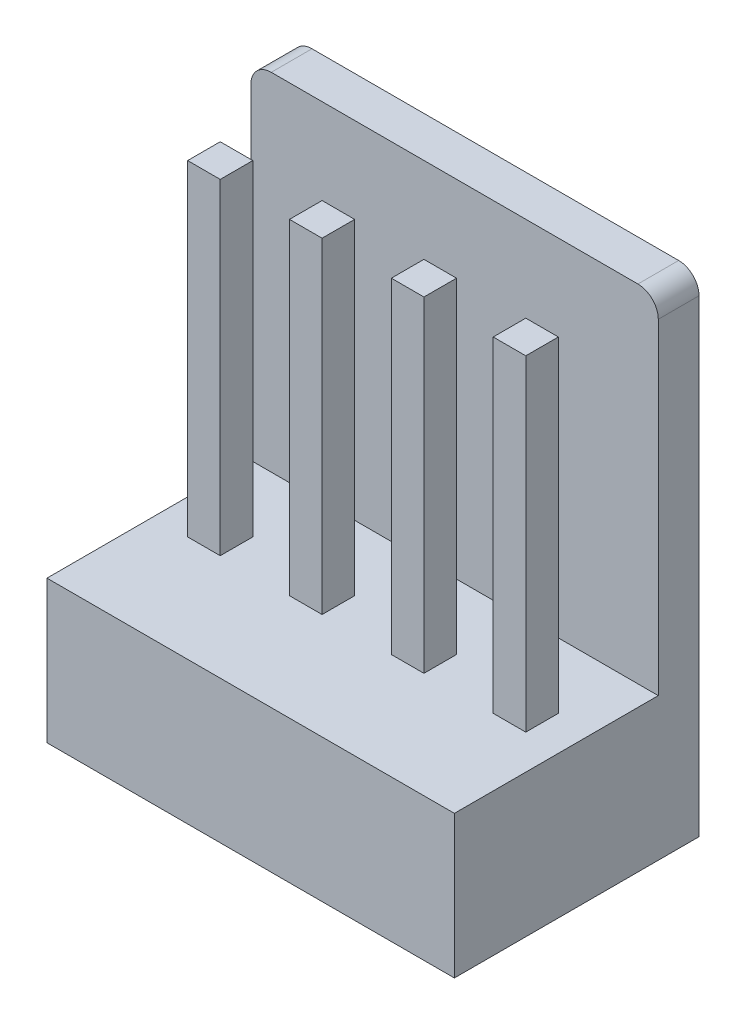
ISO-10303-21;
HEADER;
FILE_DESCRIPTION(('STEP AP214'),'2;1');
FILE_NAME('part.step','',(''),(''),'','','');
FILE_SCHEMA(('AUTOMOTIVE_DESIGN { 1 0 10303 214 1 1 1 1 }'));
ENDSEC;
DATA;
#1=APPLICATION_CONTEXT('core data for automotive mechanical design processes');
#2=APPLICATION_PROTOCOL_DEFINITION('international standard','automotive_design',2000,#1);
#3=PRODUCT_CONTEXT('',#1,'mechanical');
#4=PRODUCT('Part','Part','',(#3));
#5=PRODUCT_RELATED_PRODUCT_CATEGORY('part','',(#4));
#6=PRODUCT_DEFINITION_FORMATION('','',#4);
#7=PRODUCT_DEFINITION_CONTEXT('part definition',#1,'design');
#8=PRODUCT_DEFINITION('design','',#6,#7);
#9=PRODUCT_DEFINITION_SHAPE('','',#8);
#10=(LENGTH_UNIT() NAMED_UNIT(*) SI_UNIT(.MILLI.,.METRE.));
#11=(NAMED_UNIT(*) PLANE_ANGLE_UNIT() SI_UNIT($,.RADIAN.));
#12=(NAMED_UNIT(*) SI_UNIT($,.STERADIAN.) SOLID_ANGLE_UNIT());
#13=UNCERTAINTY_MEASURE_WITH_UNIT(LENGTH_MEASURE(1.E-05),#10,'distance_accuracy_value','');
#14=(GEOMETRIC_REPRESENTATION_CONTEXT(3) GLOBAL_UNCERTAINTY_ASSIGNED_CONTEXT((#13)) GLOBAL_UNIT_ASSIGNED_CONTEXT((#10,
#11,#12)) REPRESENTATION_CONTEXT('',''));
#15=CARTESIAN_POINT('',(0.,0.,0.));
#16=DIRECTION('',(0.,0.,1.));
#17=DIRECTION('',(1.,0.,0.));
#18=AXIS2_PLACEMENT_3D('',#15,#16,#17);
#19=CARTESIAN_POINT('',(0.,3.5,0.));
#20=DIRECTION('',(0.,-1.,0.));
#21=DIRECTION('',(0.,0.,-1.));
#22=AXIS2_PLACEMENT_3D('',#19,#20,#21);
#23=PLANE('',#22);
#24=DIRECTION('',(0.,0.,1.));
#25=VECTOR('',#24,1.);
#26=CARTESIAN_POINT('',(0.85,3.5,-0.4));
#27=LINE('',#26,#25);
#28=CARTESIAN_POINT('',(0.85,3.5,-0.4));
#29=VERTEX_POINT('',#28);
#30=CARTESIAN_POINT('',(0.85,3.5,0.4));
#31=VERTEX_POINT('',#30);
#32=EDGE_CURVE('E219',#29,#31,#27,.T.);
#33=ORIENTED_EDGE('',*,*,#32,.F.);
#34=DIRECTION('',(-1.,0.,0.));
#35=VECTOR('',#34,1.);
#36=CARTESIAN_POINT('',(1.65,3.5,-0.4));
#37=LINE('',#36,#35);
#38=CARTESIAN_POINT('',(1.65,3.5,-0.4));
#39=VERTEX_POINT('',#38);
#40=EDGE_CURVE('E232',#39,#29,#37,.T.);
#41=ORIENTED_EDGE('',*,*,#40,.F.);
#42=DIRECTION('',(0.,0.,-1.));
#43=VECTOR('',#42,1.);
#44=CARTESIAN_POINT('',(1.65,3.5,-0.4));
#45=LINE('',#44,#43);
#46=CARTESIAN_POINT('',(1.65,3.5,0.4));
#47=VERTEX_POINT('',#46);
#48=EDGE_CURVE('E241',#47,#39,#45,.T.);
#49=ORIENTED_EDGE('',*,*,#48,.F.);
#50=DIRECTION('',(1.,0.,0.));
#51=VECTOR('',#50,1.);
#52=CARTESIAN_POINT('',(1.65,3.5,0.4));
#53=LINE('',#52,#51);
#54=EDGE_CURVE('E222',#31,#47,#53,.T.);
#55=ORIENTED_EDGE('',*,*,#54,.F.);
#56=EDGE_LOOP('',(#33,#41,#49,#55));
#57=FACE_BOUND('',#56,.T.);
#58=DIRECTION('',(0.,0.,1.));
#59=VECTOR('',#58,1.);
#60=CARTESIAN_POINT('',(-4.15,3.5,-0.400000000000001));
#61=LINE('',#60,#59);
#62=CARTESIAN_POINT('',(-4.15,3.5,-0.400000000000001));
#63=VERTEX_POINT('',#62);
#64=CARTESIAN_POINT('',(-4.15,3.5,0.399999999999999));
#65=VERTEX_POINT('',#64);
#66=EDGE_CURVE('E290',#63,#65,#61,.T.);
#67=ORIENTED_EDGE('',*,*,#66,.F.);
#68=DIRECTION('',(-1.,0.,0.));
#69=VECTOR('',#68,1.);
#70=CARTESIAN_POINT('',(-3.35,3.5,-0.400000000000001));
#71=LINE('',#70,#69);
#72=CARTESIAN_POINT('',(-3.35,3.5,-0.400000000000001));
#73=VERTEX_POINT('',#72);
#74=EDGE_CURVE('E295',#73,#63,#71,.T.);
#75=ORIENTED_EDGE('',*,*,#74,.F.);
#76=DIRECTION('',(0.,0.,-1.));
#77=VECTOR('',#76,1.);
#78=CARTESIAN_POINT('',(-3.35,3.5,-0.400000000000001));
#79=LINE('',#78,#77);
#80=CARTESIAN_POINT('',(-3.35,3.5,0.399999999999999));
#81=VERTEX_POINT('',#80);
#82=EDGE_CURVE('E307',#81,#73,#79,.T.);
#83=ORIENTED_EDGE('',*,*,#82,.F.);
#84=DIRECTION('',(1.,0.,0.));
#85=VECTOR('',#84,1.);
#86=CARTESIAN_POINT('',(-3.35,3.5,0.399999999999999));
#87=LINE('',#86,#85);
#88=EDGE_CURVE('E304',#65,#81,#87,.T.);
#89=ORIENTED_EDGE('',*,*,#88,.F.);
#90=EDGE_LOOP('',(#67,#75,#83,#89));
#91=FACE_BOUND('',#90,.T.);
#92=DIRECTION('',(1.,0.,0.));
#93=VECTOR('',#92,1.);
#94=CARTESIAN_POINT('',(-5.,3.5,-2.00245098039216));
#95=LINE('',#94,#93);
#96=CARTESIAN_POINT('',(-5.,3.5,-2.00245098039216));
#97=VERTEX_POINT('',#96);
#98=CARTESIAN_POINT('',(5.,3.5,-2.00245098039216));
#99=VERTEX_POINT('',#98);
#100=EDGE_CURVE('E323',#97,#99,#95,.T.);
#101=ORIENTED_EDGE('',*,*,#100,.F.);
#102=DIRECTION('',(0.,0.,1.));
#103=VECTOR('',#102,1.);
#104=CARTESIAN_POINT('',(-5.,3.5,3.00245098039216));
#105=LINE('',#104,#103);
#106=CARTESIAN_POINT('',(-5.,3.5,3.00245098039216));
#107=VERTEX_POINT('',#106);
#108=EDGE_CURVE('E340',#97,#107,#105,.T.);
#109=ORIENTED_EDGE('',*,*,#108,.T.);
#110=DIRECTION('',(1.,0.,0.));
#111=VECTOR('',#110,1.);
#112=CARTESIAN_POINT('',(-5.,3.5,3.00245098039216));
#113=LINE('',#112,#111);
#114=CARTESIAN_POINT('',(5.,3.5,3.00245098039216));
#115=VERTEX_POINT('',#114);
#116=EDGE_CURVE('E343',#107,#115,#113,.T.);
#117=ORIENTED_EDGE('',*,*,#116,.T.);
#118=DIRECTION('',(0.,0.,-1.));
#119=VECTOR('',#118,1.);
#120=CARTESIAN_POINT('',(5.,3.5,3.00245098039216));
#121=LINE('',#120,#119);
#122=EDGE_CURVE('E337',#115,#99,#121,.T.);
#123=ORIENTED_EDGE('',*,*,#122,.T.);
#124=EDGE_LOOP('',(#101,#109,#117,#123));
#125=FACE_BOUND('',#124,.T.);
#126=DIRECTION('',(0.,0.,1.));
#127=VECTOR('',#126,1.);
#128=CARTESIAN_POINT('',(-1.65,3.5,-0.4));
#129=LINE('',#128,#127);
#130=CARTESIAN_POINT('',(-1.65,3.5,-0.4));
#131=VERTEX_POINT('',#130);
#132=CARTESIAN_POINT('',(-1.65,3.5,0.4));
#133=VERTEX_POINT('',#132);
#134=EDGE_CURVE('E257',#131,#133,#129,.T.);
#135=ORIENTED_EDGE('',*,*,#134,.F.);
#136=DIRECTION('',(-1.,0.,0.));
#137=VECTOR('',#136,1.);
#138=CARTESIAN_POINT('',(-0.85,3.5,-0.4));
#139=LINE('',#138,#137);
#140=CARTESIAN_POINT('',(-0.85,3.5,-0.4));
#141=VERTEX_POINT('',#140);
#142=EDGE_CURVE('E262',#141,#131,#139,.T.);
#143=ORIENTED_EDGE('',*,*,#142,.F.);
#144=DIRECTION('',(0.,0.,-1.));
#145=VECTOR('',#144,1.);
#146=CARTESIAN_POINT('',(-0.85,3.5,-0.4));
#147=LINE('',#146,#145);
#148=CARTESIAN_POINT('',(-0.85,3.5,0.4));
#149=VERTEX_POINT('',#148);
#150=EDGE_CURVE('E274',#149,#141,#147,.T.);
#151=ORIENTED_EDGE('',*,*,#150,.F.);
#152=DIRECTION('',(1.,0.,0.));
#153=VECTOR('',#152,1.);
#154=CARTESIAN_POINT('',(-0.85,3.5,0.4));
#155=LINE('',#154,#153);
#156=EDGE_CURVE('E271',#133,#149,#155,.T.);
#157=ORIENTED_EDGE('',*,*,#156,.F.);
#158=EDGE_LOOP('',(#135,#143,#151,#157));
#159=FACE_BOUND('',#158,.T.);
#160=DIRECTION('',(0.,0.,1.));
#161=VECTOR('',#160,1.);
#162=CARTESIAN_POINT('',(3.35,3.5,-0.400000000000001));
#163=LINE('',#162,#161);
#164=CARTESIAN_POINT('',(3.35,3.5,-0.400000000000001));
#165=VERTEX_POINT('',#164);
#166=CARTESIAN_POINT('',(3.35,3.5,0.399999999999999));
#167=VERTEX_POINT('',#166);
#168=EDGE_CURVE('E218',#165,#167,#163,.T.);
#169=ORIENTED_EDGE('',*,*,#168,.F.);
#170=DIRECTION('',(-1.,0.,0.));
#171=VECTOR('',#170,1.);
#172=CARTESIAN_POINT('',(4.15,3.5,-0.400000000000001));
#173=LINE('',#172,#171);
#174=CARTESIAN_POINT('',(4.15,3.5,-0.400000000000001));
#175=VERTEX_POINT('',#174);
#176=EDGE_CURVE('E215',#175,#165,#173,.T.);
#177=ORIENTED_EDGE('',*,*,#176,.F.);
#178=DIRECTION('',(0.,0.,-1.));
#179=VECTOR('',#178,1.);
#180=CARTESIAN_POINT('',(4.15,3.5,-0.400000000000001));
#181=LINE('',#180,#179);
#182=CARTESIAN_POINT('',(4.15,3.5,0.399999999999999));
#183=VERTEX_POINT('',#182);
#184=EDGE_CURVE('E697',#183,#175,#181,.T.);
#185=ORIENTED_EDGE('',*,*,#184,.F.);
#186=DIRECTION('',(1.,0.,0.));
#187=VECTOR('',#186,1.);
#188=CARTESIAN_POINT('',(4.15,3.5,0.399999999999999));
#189=LINE('',#188,#187);
#190=EDGE_CURVE('E703',#167,#183,#189,.T.);
#191=ORIENTED_EDGE('',*,*,#190,.F.);
#192=EDGE_LOOP('',(#169,#177,#185,#191));
#193=FACE_BOUND('',#192,.T.);
#194=ADVANCED_FACE('F33',(#57,#91,#125,#159,#193),#23,.F.);
#195=CARTESIAN_POINT('',(5.,3.5,3.00245098039216));
#196=DIRECTION('',(-1.,0.,0.));
#197=DIRECTION('',(0.,0.,1.));
#198=AXIS2_PLACEMENT_3D('',#195,#196,#197);
#199=PLANE('',#198);
#200=DIRECTION('',(0.,-1.,0.));
#201=VECTOR('',#200,1.);
#202=CARTESIAN_POINT('',(5.,3.5,-3.00245098039216));
#203=LINE('',#202,#201);
#204=CARTESIAN_POINT('',(5.,11.5,-3.00245098039216));
#205=VERTEX_POINT('',#204);
#206=CARTESIAN_POINT('',(5.,0.,-3.00245098039216));
#207=VERTEX_POINT('',#206);
#208=EDGE_CURVE('E361',#205,#207,#203,.T.);
#209=ORIENTED_EDGE('',*,*,#208,.F.);
#210=DIRECTION('',(0.,0.,-1.));
#211=VECTOR('',#210,1.);
#212=CARTESIAN_POINT('',(5.,11.5,-2.00245098039216));
#213=LINE('',#212,#211);
#214=CARTESIAN_POINT('',(5.,11.5,-2.00245098039216));
#215=VERTEX_POINT('',#214);
#216=EDGE_CURVE('E11',#205,#215,#213,.F.);
#217=ORIENTED_EDGE('',*,*,#216,.T.);
#218=DIRECTION('',(0.,-1.,0.));
#219=VECTOR('',#218,1.);
#220=CARTESIAN_POINT('',(5.,12.,-2.00245098039216));
#221=LINE('',#220,#219);
#222=EDGE_CURVE('E330',#215,#99,#221,.T.);
#223=ORIENTED_EDGE('',*,*,#222,.T.);
#224=ORIENTED_EDGE('',*,*,#122,.F.);
#225=DIRECTION('',(0.,-1.,0.));
#226=VECTOR('',#225,1.);
#227=CARTESIAN_POINT('',(5.,3.5,3.00245098039216));
#228=LINE('',#227,#226);
#229=CARTESIAN_POINT('',(5.,0.,3.00245098039216));
#230=VERTEX_POINT('',#229);
#231=EDGE_CURVE('E345',#115,#230,#228,.T.);
#232=ORIENTED_EDGE('',*,*,#231,.T.);
#233=DIRECTION('',(0.,0.,-1.));
#234=VECTOR('',#233,1.);
#235=CARTESIAN_POINT('',(5.,0.,3.00245098039216));
#236=LINE('',#235,#234);
#237=EDGE_CURVE('E336',#230,#207,#236,.T.);
#238=ORIENTED_EDGE('',*,*,#237,.T.);
#239=EDGE_LOOP('',(#209,#217,#223,#224,#232,#238));
#240=FACE_BOUND('',#239,.T.);
#241=ADVANCED_FACE('F399',(#240),#199,.F.);
#242=CARTESIAN_POINT('',(-5.,3.5,-3.00245098039216));
#243=DIRECTION('',(0.,0.,1.));
#244=DIRECTION('',(1.,0.,0.));
#245=AXIS2_PLACEMENT_3D('',#242,#243,#244);
#246=PLANE('',#245);
#247=DIRECTION('',(0.,-1.,0.));
#248=VECTOR('',#247,1.);
#249=CARTESIAN_POINT('',(-5.,3.5,-3.00245098039216));
#250=LINE('',#249,#248);
#251=CARTESIAN_POINT('',(-5.,11.5,-3.00245098039216));
#252=VERTEX_POINT('',#251);
#253=CARTESIAN_POINT('',(-5.,0.,-3.00245098039216));
#254=VERTEX_POINT('',#253);
#255=EDGE_CURVE('E359',#252,#254,#250,.T.);
#256=ORIENTED_EDGE('',*,*,#255,.F.);
#257=CARTESIAN_POINT('',(-4.5,11.5,-3.00245098039216));
#258=DIRECTION('',(0.,0.,1.));
#259=DIRECTION('',(1.,0.,0.));
#260=AXIS2_PLACEMENT_3D('',#257,#258,#259);
#261=CIRCLE('',#260,0.5);
#262=CARTESIAN_POINT('',(-4.5,12.,-3.00245098039216));
#263=VERTEX_POINT('',#262);
#264=EDGE_CURVE('E41',#252,#263,#261,.F.);
#265=ORIENTED_EDGE('',*,*,#264,.T.);
#266=DIRECTION('',(-1.,0.,0.));
#267=VECTOR('',#266,1.);
#268=CARTESIAN_POINT('',(-5.,12.,-3.00245098039216));
#269=LINE('',#268,#267);
#270=CARTESIAN_POINT('',(4.5,12.,-3.00245098039216));
#271=VERTEX_POINT('',#270);
#272=EDGE_CURVE('E327',#271,#263,#269,.T.);
#273=ORIENTED_EDGE('',*,*,#272,.F.);
#274=CARTESIAN_POINT('',(4.5,11.5,-3.00245098039216));
#275=DIRECTION('',(0.,0.,1.));
#276=DIRECTION('',(1.,0.,0.));
#277=AXIS2_PLACEMENT_3D('',#274,#275,#276);
#278=CIRCLE('',#277,0.5);
#279=EDGE_CURVE('E48',#271,#205,#278,.F.);
#280=ORIENTED_EDGE('',*,*,#279,.T.);
#281=ORIENTED_EDGE('',*,*,#208,.T.);
#282=DIRECTION('',(-1.,0.,0.));
#283=VECTOR('',#282,1.);
#284=CARTESIAN_POINT('',(-5.,0.,-3.00245098039216));
#285=LINE('',#284,#283);
#286=EDGE_CURVE('E348',#207,#254,#285,.T.);
#287=ORIENTED_EDGE('',*,*,#286,.T.);
#288=EDGE_LOOP('',(#256,#265,#273,#280,#281,#287));
#289=FACE_BOUND('',#288,.T.);
#290=ADVANCED_FACE('F375',(#289),#246,.F.);
#291=CARTESIAN_POINT('',(-5.,3.5,3.00245098039216));
#292=DIRECTION('',(1.,0.,0.));
#293=DIRECTION('',(0.,0.,-1.));
#294=AXIS2_PLACEMENT_3D('',#291,#292,#293);
#295=PLANE('',#294);
#296=DIRECTION('',(0.,-1.,0.));
#297=VECTOR('',#296,1.);
#298=CARTESIAN_POINT('',(-5.,12.,-2.00245098039216));
#299=LINE('',#298,#297);
#300=CARTESIAN_POINT('',(-5.,11.5,-2.00245098039216));
#301=VERTEX_POINT('',#300);
#302=EDGE_CURVE('E334',#301,#97,#299,.T.);
#303=ORIENTED_EDGE('',*,*,#302,.F.);
#304=DIRECTION('',(0.,0.,1.));
#305=VECTOR('',#304,1.);
#306=CARTESIAN_POINT('',(-5.,11.5,-3.00245098039216));
#307=LINE('',#306,#305);
#308=EDGE_CURVE('E56',#301,#252,#307,.F.);
#309=ORIENTED_EDGE('',*,*,#308,.T.);
#310=ORIENTED_EDGE('',*,*,#255,.T.);
#311=DIRECTION('',(0.,0.,1.));
#312=VECTOR('',#311,1.);
#313=CARTESIAN_POINT('',(-5.,0.,3.00245098039216));
#314=LINE('',#313,#312);
#315=CARTESIAN_POINT('',(-5.,0.,3.00245098039216));
#316=VERTEX_POINT('',#315);
#317=EDGE_CURVE('E351',#254,#316,#314,.T.);
#318=ORIENTED_EDGE('',*,*,#317,.T.);
#319=DIRECTION('',(0.,-1.,0.));
#320=VECTOR('',#319,1.);
#321=CARTESIAN_POINT('',(-5.,3.5,3.00245098039216));
#322=LINE('',#321,#320);
#323=EDGE_CURVE('E356',#107,#316,#322,.T.);
#324=ORIENTED_EDGE('',*,*,#323,.F.);
#325=ORIENTED_EDGE('',*,*,#108,.F.);
#326=EDGE_LOOP('',(#303,#309,#310,#318,#324,#325));
#327=FACE_BOUND('',#326,.T.);
#328=ADVANCED_FACE('F387',(#327),#295,.F.);
#329=CARTESIAN_POINT('',(-5.,3.5,3.00245098039216));
#330=DIRECTION('',(0.,0.,-1.));
#331=DIRECTION('',(-1.,0.,0.));
#332=AXIS2_PLACEMENT_3D('',#329,#330,#331);
#333=PLANE('',#332);
#334=DIRECTION('',(1.,0.,0.));
#335=VECTOR('',#334,1.);
#336=CARTESIAN_POINT('',(-5.,0.,3.00245098039216));
#337=LINE('',#336,#335);
#338=EDGE_CURVE('E341',#316,#230,#337,.T.);
#339=ORIENTED_EDGE('',*,*,#338,.T.);
#340=ORIENTED_EDGE('',*,*,#231,.F.);
#341=ORIENTED_EDGE('',*,*,#116,.F.);
#342=ORIENTED_EDGE('',*,*,#323,.T.);
#343=EDGE_LOOP('',(#339,#340,#341,#342));
#344=FACE_BOUND('',#343,.T.);
#345=ADVANCED_FACE('F407',(#344),#333,.F.);
#346=CARTESIAN_POINT('',(0.,0.,0.));
#347=DIRECTION('',(0.,-1.,0.));
#348=DIRECTION('',(0.,0.,-1.));
#349=AXIS2_PLACEMENT_3D('',#346,#347,#348);
#350=PLANE('',#349);
#351=ORIENTED_EDGE('',*,*,#237,.F.);
#352=ORIENTED_EDGE('',*,*,#338,.F.);
#353=ORIENTED_EDGE('',*,*,#317,.F.);
#354=ORIENTED_EDGE('',*,*,#286,.F.);
#355=EDGE_LOOP('',(#351,#352,#353,#354));
#356=FACE_BOUND('',#355,.T.);
#357=ADVANCED_FACE('F404',(#356),#350,.T.);
#358=CARTESIAN_POINT('',(-5.,12.,-2.00245098039216));
#359=DIRECTION('',(0.,0.,-1.));
#360=DIRECTION('',(-1.,0.,0.));
#361=AXIS2_PLACEMENT_3D('',#358,#359,#360);
#362=PLANE('',#361);
#363=DIRECTION('',(1.,0.,0.));
#364=VECTOR('',#363,1.);
#365=CARTESIAN_POINT('',(-5.,12.,-2.00245098039216));
#366=LINE('',#365,#364);
#367=CARTESIAN_POINT('',(-4.5,12.,-2.00245098039216));
#368=VERTEX_POINT('',#367);
#369=CARTESIAN_POINT('',(4.5,12.,-2.00245098039216));
#370=VERTEX_POINT('',#369);
#371=EDGE_CURVE('E324',#368,#370,#366,.T.);
#372=ORIENTED_EDGE('',*,*,#371,.F.);
#373=CARTESIAN_POINT('',(-4.5,11.5,-2.00245098039216));
#374=DIRECTION('',(0.,0.,-1.));
#375=DIRECTION('',(-1.,0.,0.));
#376=AXIS2_PLACEMENT_3D('',#373,#374,#375);
#377=CIRCLE('',#376,0.5);
#378=EDGE_CURVE('E371',#368,#301,#377,.F.);
#379=ORIENTED_EDGE('',*,*,#378,.T.);
#380=ORIENTED_EDGE('',*,*,#302,.T.);
#381=ORIENTED_EDGE('',*,*,#100,.T.);
#382=ORIENTED_EDGE('',*,*,#222,.F.);
#383=CARTESIAN_POINT('',(4.5,11.5,-2.00245098039216));
#384=DIRECTION('',(0.,0.,-1.));
#385=DIRECTION('',(-1.,0.,0.));
#386=AXIS2_PLACEMENT_3D('',#383,#384,#385);
#387=CIRCLE('',#386,0.5);
#388=EDGE_CURVE('E369',#215,#370,#387,.F.);
#389=ORIENTED_EDGE('',*,*,#388,.T.);
#390=EDGE_LOOP('',(#372,#379,#380,#381,#382,#389));
#391=FACE_BOUND('',#390,.T.);
#392=ADVANCED_FACE('F384',(#391),#362,.F.);
#393=CARTESIAN_POINT('',(0.,12.,0.));
#394=DIRECTION('',(0.,1.,0.));
#395=DIRECTION('',(0.,0.,1.));
#396=AXIS2_PLACEMENT_3D('',#393,#394,#395);
#397=PLANE('',#396);
#398=ORIENTED_EDGE('',*,*,#272,.T.);
#399=DIRECTION('',(0.,0.,1.));
#400=VECTOR('',#399,1.);
#401=CARTESIAN_POINT('',(-4.5,12.,-2.00245098039216));
#402=LINE('',#401,#400);
#403=EDGE_CURVE('E366',#263,#368,#402,.T.);
#404=ORIENTED_EDGE('',*,*,#403,.T.);
#405=ORIENTED_EDGE('',*,*,#371,.T.);
#406=DIRECTION('',(0.,0.,-1.));
#407=VECTOR('',#406,1.);
#408=CARTESIAN_POINT('',(4.5,12.,-3.00245098039216));
#409=LINE('',#408,#407);
#410=EDGE_CURVE('E363',#370,#271,#409,.T.);
#411=ORIENTED_EDGE('',*,*,#410,.T.);
#412=EDGE_LOOP('',(#398,#404,#405,#411));
#413=FACE_BOUND('',#412,.T.);
#414=ADVANCED_FACE('F379',(#413),#397,.T.);
#415=CARTESIAN_POINT('',(-4.15,11.5,-0.400000000000001));
#416=DIRECTION('',(1.,0.,0.));
#417=DIRECTION('',(0.,0.,-1.));
#418=AXIS2_PLACEMENT_3D('',#415,#416,#417);
#419=PLANE('',#418);
#420=ORIENTED_EDGE('',*,*,#66,.T.);
#421=DIRECTION('',(0.,-1.,0.));
#422=VECTOR('',#421,1.);
#423=CARTESIAN_POINT('',(-4.15,11.5,0.399999999999999));
#424=LINE('',#423,#422);
#425=CARTESIAN_POINT('',(-4.15,11.5,0.399999999999999));
#426=VERTEX_POINT('',#425);
#427=EDGE_CURVE('E320',#426,#65,#424,.T.);
#428=ORIENTED_EDGE('',*,*,#427,.F.);
#429=DIRECTION('',(0.,0.,1.));
#430=VECTOR('',#429,1.);
#431=CARTESIAN_POINT('',(-4.15,11.5,-0.400000000000001));
#432=LINE('',#431,#430);
#433=CARTESIAN_POINT('',(-4.15,11.5,-0.400000000000001));
#434=VERTEX_POINT('',#433);
#435=EDGE_CURVE('E291',#434,#426,#432,.T.);
#436=ORIENTED_EDGE('',*,*,#435,.F.);
#437=DIRECTION('',(0.,-1.,0.));
#438=VECTOR('',#437,1.);
#439=CARTESIAN_POINT('',(-4.15,11.5,-0.400000000000001));
#440=LINE('',#439,#438);
#441=EDGE_CURVE('E301',#434,#63,#440,.T.);
#442=ORIENTED_EDGE('',*,*,#441,.T.);
#443=EDGE_LOOP('',(#420,#428,#436,#442));
#444=FACE_BOUND('',#443,.T.);
#445=ADVANCED_FACE('F429',(#444),#419,.F.);
#446=CARTESIAN_POINT('',(-3.35,11.5,0.399999999999999));
#447=DIRECTION('',(0.,0.,-1.));
#448=DIRECTION('',(-1.,0.,0.));
#449=AXIS2_PLACEMENT_3D('',#446,#447,#448);
#450=PLANE('',#449);
#451=ORIENTED_EDGE('',*,*,#88,.T.);
#452=DIRECTION('',(0.,-1.,0.));
#453=VECTOR('',#452,1.);
#454=CARTESIAN_POINT('',(-3.35,11.5,0.399999999999999));
#455=LINE('',#454,#453);
#456=CARTESIAN_POINT('',(-3.35,11.5,0.399999999999999));
#457=VERTEX_POINT('',#456);
#458=EDGE_CURVE('E317',#457,#81,#455,.T.);
#459=ORIENTED_EDGE('',*,*,#458,.F.);
#460=DIRECTION('',(1.,0.,0.));
#461=VECTOR('',#460,1.);
#462=CARTESIAN_POINT('',(-3.35,11.5,0.399999999999999));
#463=LINE('',#462,#461);
#464=EDGE_CURVE('E294',#426,#457,#463,.T.);
#465=ORIENTED_EDGE('',*,*,#464,.F.);
#466=ORIENTED_EDGE('',*,*,#427,.T.);
#467=EDGE_LOOP('',(#451,#459,#465,#466));
#468=FACE_BOUND('',#467,.T.);
#469=ADVANCED_FACE('F432',(#468),#450,.F.);
#470=CARTESIAN_POINT('',(-3.35,11.5,-0.400000000000001));
#471=DIRECTION('',(-1.,0.,0.));
#472=DIRECTION('',(0.,0.,1.));
#473=AXIS2_PLACEMENT_3D('',#470,#471,#472);
#474=PLANE('',#473);
#475=ORIENTED_EDGE('',*,*,#82,.T.);
#476=DIRECTION('',(0.,-1.,0.));
#477=VECTOR('',#476,1.);
#478=CARTESIAN_POINT('',(-3.35,11.5,-0.400000000000001));
#479=LINE('',#478,#477);
#480=CARTESIAN_POINT('',(-3.35,11.5,-0.400000000000001));
#481=VERTEX_POINT('',#480);
#482=EDGE_CURVE('E314',#481,#73,#479,.T.);
#483=ORIENTED_EDGE('',*,*,#482,.F.);
#484=DIRECTION('',(0.,0.,-1.));
#485=VECTOR('',#484,1.);
#486=CARTESIAN_POINT('',(-3.35,11.5,-0.400000000000001));
#487=LINE('',#486,#485);
#488=EDGE_CURVE('E297',#457,#481,#487,.T.);
#489=ORIENTED_EDGE('',*,*,#488,.F.);
#490=ORIENTED_EDGE('',*,*,#458,.T.);
#491=EDGE_LOOP('',(#475,#483,#489,#490));
#492=FACE_BOUND('',#491,.T.);
#493=ADVANCED_FACE('F436',(#492),#474,.F.);
#494=CARTESIAN_POINT('',(-3.35,11.5,-0.400000000000001));
#495=DIRECTION('',(0.,0.,1.));
#496=DIRECTION('',(1.,0.,0.));
#497=AXIS2_PLACEMENT_3D('',#494,#495,#496);
#498=PLANE('',#497);
#499=ORIENTED_EDGE('',*,*,#74,.T.);
#500=ORIENTED_EDGE('',*,*,#441,.F.);
#501=DIRECTION('',(-1.,0.,0.));
#502=VECTOR('',#501,1.);
#503=CARTESIAN_POINT('',(-3.35,11.5,-0.400000000000001));
#504=LINE('',#503,#502);
#505=EDGE_CURVE('E299',#481,#434,#504,.T.);
#506=ORIENTED_EDGE('',*,*,#505,.F.);
#507=ORIENTED_EDGE('',*,*,#482,.T.);
#508=EDGE_LOOP('',(#499,#500,#506,#507));
#509=FACE_BOUND('',#508,.T.);
#510=ADVANCED_FACE('F440',(#509),#498,.F.);
#511=CARTESIAN_POINT('',(0.,11.5,0.));
#512=DIRECTION('',(0.,-1.,0.));
#513=DIRECTION('',(0.,0.,-1.));
#514=AXIS2_PLACEMENT_3D('',#511,#512,#513);
#515=PLANE('',#514);
#516=ORIENTED_EDGE('',*,*,#435,.T.);
#517=ORIENTED_EDGE('',*,*,#464,.T.);
#518=ORIENTED_EDGE('',*,*,#488,.T.);
#519=ORIENTED_EDGE('',*,*,#505,.T.);
#520=EDGE_LOOP('',(#516,#517,#518,#519));
#521=FACE_BOUND('',#520,.T.);
#522=ADVANCED_FACE('F444',(#521),#515,.F.);
#523=CARTESIAN_POINT('',(-1.65,11.5,-0.4));
#524=DIRECTION('',(1.,0.,0.));
#525=DIRECTION('',(0.,0.,-1.));
#526=AXIS2_PLACEMENT_3D('',#523,#524,#525);
#527=PLANE('',#526);
#528=ORIENTED_EDGE('',*,*,#134,.T.);
#529=DIRECTION('',(0.,-1.,0.));
#530=VECTOR('',#529,1.);
#531=CARTESIAN_POINT('',(-1.65,11.5,0.4));
#532=LINE('',#531,#530);
#533=CARTESIAN_POINT('',(-1.65,11.5,0.4));
#534=VERTEX_POINT('',#533);
#535=EDGE_CURVE('E287',#534,#133,#532,.T.);
#536=ORIENTED_EDGE('',*,*,#535,.F.);
#537=DIRECTION('',(0.,0.,1.));
#538=VECTOR('',#537,1.);
#539=CARTESIAN_POINT('',(-1.65,11.5,-0.4));
#540=LINE('',#539,#538);
#541=CARTESIAN_POINT('',(-1.65,11.5,-0.4));
#542=VERTEX_POINT('',#541);
#543=EDGE_CURVE('E258',#542,#534,#540,.T.);
#544=ORIENTED_EDGE('',*,*,#543,.F.);
#545=DIRECTION('',(0.,-1.,0.));
#546=VECTOR('',#545,1.);
#547=CARTESIAN_POINT('',(-1.65,11.5,-0.4));
#548=LINE('',#547,#546);
#549=EDGE_CURVE('E268',#542,#131,#548,.T.);
#550=ORIENTED_EDGE('',*,*,#549,.T.);
#551=EDGE_LOOP('',(#528,#536,#544,#550));
#552=FACE_BOUND('',#551,.T.);
#553=ADVANCED_FACE('F448',(#552),#527,.F.);
#554=CARTESIAN_POINT('',(-0.85,11.5,0.4));
#555=DIRECTION('',(0.,0.,-1.));
#556=DIRECTION('',(-1.,0.,0.));
#557=AXIS2_PLACEMENT_3D('',#554,#555,#556);
#558=PLANE('',#557);
#559=ORIENTED_EDGE('',*,*,#156,.T.);
#560=DIRECTION('',(0.,-1.,0.));
#561=VECTOR('',#560,1.);
#562=CARTESIAN_POINT('',(-0.85,11.5,0.4));
#563=LINE('',#562,#561);
#564=CARTESIAN_POINT('',(-0.85,11.5,0.4));
#565=VERTEX_POINT('',#564);
#566=EDGE_CURVE('E284',#565,#149,#563,.T.);
#567=ORIENTED_EDGE('',*,*,#566,.F.);
#568=DIRECTION('',(1.,0.,0.));
#569=VECTOR('',#568,1.);
#570=CARTESIAN_POINT('',(-0.85,11.5,0.4));
#571=LINE('',#570,#569);
#572=EDGE_CURVE('E261',#534,#565,#571,.T.);
#573=ORIENTED_EDGE('',*,*,#572,.F.);
#574=ORIENTED_EDGE('',*,*,#535,.T.);
#575=EDGE_LOOP('',(#559,#567,#573,#574));
#576=FACE_BOUND('',#575,.T.);
#577=ADVANCED_FACE('F452',(#576),#558,.F.);
#578=CARTESIAN_POINT('',(-0.85,11.5,-0.4));
#579=DIRECTION('',(-1.,0.,0.));
#580=DIRECTION('',(0.,0.,1.));
#581=AXIS2_PLACEMENT_3D('',#578,#579,#580);
#582=PLANE('',#581);
#583=ORIENTED_EDGE('',*,*,#150,.T.);
#584=DIRECTION('',(0.,-1.,0.));
#585=VECTOR('',#584,1.);
#586=CARTESIAN_POINT('',(-0.85,11.5,-0.4));
#587=LINE('',#586,#585);
#588=CARTESIAN_POINT('',(-0.85,11.5,-0.4));
#589=VERTEX_POINT('',#588);
#590=EDGE_CURVE('E281',#589,#141,#587,.T.);
#591=ORIENTED_EDGE('',*,*,#590,.F.);
#592=DIRECTION('',(0.,0.,-1.));
#593=VECTOR('',#592,1.);
#594=CARTESIAN_POINT('',(-0.85,11.5,-0.4));
#595=LINE('',#594,#593);
#596=EDGE_CURVE('E264',#565,#589,#595,.T.);
#597=ORIENTED_EDGE('',*,*,#596,.F.);
#598=ORIENTED_EDGE('',*,*,#566,.T.);
#599=EDGE_LOOP('',(#583,#591,#597,#598));
#600=FACE_BOUND('',#599,.T.);
#601=ADVANCED_FACE('F456',(#600),#582,.F.);
#602=CARTESIAN_POINT('',(-0.85,11.5,-0.4));
#603=DIRECTION('',(0.,0.,1.));
#604=DIRECTION('',(1.,0.,0.));
#605=AXIS2_PLACEMENT_3D('',#602,#603,#604);
#606=PLANE('',#605);
#607=ORIENTED_EDGE('',*,*,#142,.T.);
#608=ORIENTED_EDGE('',*,*,#549,.F.);
#609=DIRECTION('',(-1.,0.,0.));
#610=VECTOR('',#609,1.);
#611=CARTESIAN_POINT('',(-0.85,11.5,-0.4));
#612=LINE('',#611,#610);
#613=EDGE_CURVE('E266',#589,#542,#612,.T.);
#614=ORIENTED_EDGE('',*,*,#613,.F.);
#615=ORIENTED_EDGE('',*,*,#590,.T.);
#616=EDGE_LOOP('',(#607,#608,#614,#615));
#617=FACE_BOUND('',#616,.T.);
#618=ADVANCED_FACE('F460',(#617),#606,.F.);
#619=CARTESIAN_POINT('',(0.,11.5,0.));
#620=DIRECTION('',(0.,-1.,0.));
#621=DIRECTION('',(0.,0.,-1.));
#622=AXIS2_PLACEMENT_3D('',#619,#620,#621);
#623=PLANE('',#622);
#624=ORIENTED_EDGE('',*,*,#543,.T.);
#625=ORIENTED_EDGE('',*,*,#572,.T.);
#626=ORIENTED_EDGE('',*,*,#596,.T.);
#627=ORIENTED_EDGE('',*,*,#613,.T.);
#628=EDGE_LOOP('',(#624,#625,#626,#627));
#629=FACE_BOUND('',#628,.T.);
#630=ADVANCED_FACE('F464',(#629),#623,.F.);
#631=CARTESIAN_POINT('',(0.85,11.5,-0.4));
#632=DIRECTION('',(1.,0.,0.));
#633=DIRECTION('',(0.,0.,-1.));
#634=AXIS2_PLACEMENT_3D('',#631,#632,#633);
#635=PLANE('',#634);
#636=ORIENTED_EDGE('',*,*,#32,.T.);
#637=DIRECTION('',(0.,-1.,0.));
#638=VECTOR('',#637,1.);
#639=CARTESIAN_POINT('',(0.85,11.5,0.4));
#640=LINE('',#639,#638);
#641=CARTESIAN_POINT('',(0.85,11.5,0.4));
#642=VERTEX_POINT('',#641);
#643=EDGE_CURVE('E254',#642,#31,#640,.T.);
#644=ORIENTED_EDGE('',*,*,#643,.F.);
#645=DIRECTION('',(0.,0.,1.));
#646=VECTOR('',#645,1.);
#647=CARTESIAN_POINT('',(0.85,11.5,-0.4));
#648=LINE('',#647,#646);
#649=CARTESIAN_POINT('',(0.85,11.5,-0.4));
#650=VERTEX_POINT('',#649);
#651=EDGE_CURVE('E228',#650,#642,#648,.T.);
#652=ORIENTED_EDGE('',*,*,#651,.F.);
#653=DIRECTION('',(0.,-1.,0.));
#654=VECTOR('',#653,1.);
#655=CARTESIAN_POINT('',(0.85,11.5,-0.4));
#656=LINE('',#655,#654);
#657=EDGE_CURVE('E237',#650,#29,#656,.T.);
#658=ORIENTED_EDGE('',*,*,#657,.T.);
#659=EDGE_LOOP('',(#636,#644,#652,#658));
#660=FACE_BOUND('',#659,.T.);
#661=ADVANCED_FACE('F468',(#660),#635,.F.);
#662=CARTESIAN_POINT('',(1.65,11.5,0.4));
#663=DIRECTION('',(0.,0.,-1.));
#664=DIRECTION('',(-1.,0.,0.));
#665=AXIS2_PLACEMENT_3D('',#662,#663,#664);
#666=PLANE('',#665);
#667=ORIENTED_EDGE('',*,*,#54,.T.);
#668=DIRECTION('',(0.,-1.,0.));
#669=VECTOR('',#668,1.);
#670=CARTESIAN_POINT('',(1.65,11.5,0.4));
#671=LINE('',#670,#669);
#672=CARTESIAN_POINT('',(1.65,11.5,0.4));
#673=VERTEX_POINT('',#672);
#674=EDGE_CURVE('E251',#673,#47,#671,.T.);
#675=ORIENTED_EDGE('',*,*,#674,.F.);
#676=DIRECTION('',(1.,0.,0.));
#677=VECTOR('',#676,1.);
#678=CARTESIAN_POINT('',(1.65,11.5,0.4));
#679=LINE('',#678,#677);
#680=EDGE_CURVE('E231',#642,#673,#679,.T.);
#681=ORIENTED_EDGE('',*,*,#680,.F.);
#682=ORIENTED_EDGE('',*,*,#643,.T.);
#683=EDGE_LOOP('',(#667,#675,#681,#682));
#684=FACE_BOUND('',#683,.T.);
#685=ADVANCED_FACE('F472',(#684),#666,.F.);
#686=CARTESIAN_POINT('',(1.65,11.5,-0.4));
#687=DIRECTION('',(-1.,0.,0.));
#688=DIRECTION('',(0.,0.,1.));
#689=AXIS2_PLACEMENT_3D('',#686,#687,#688);
#690=PLANE('',#689);
#691=ORIENTED_EDGE('',*,*,#48,.T.);
#692=DIRECTION('',(0.,-1.,0.));
#693=VECTOR('',#692,1.);
#694=CARTESIAN_POINT('',(1.65,11.5,-0.4));
#695=LINE('',#694,#693);
#696=CARTESIAN_POINT('',(1.65,11.5,-0.4));
#697=VERTEX_POINT('',#696);
#698=EDGE_CURVE('E248',#697,#39,#695,.T.);
#699=ORIENTED_EDGE('',*,*,#698,.F.);
#700=DIRECTION('',(0.,0.,-1.));
#701=VECTOR('',#700,1.);
#702=CARTESIAN_POINT('',(1.65,11.5,-0.4));
#703=LINE('',#702,#701);
#704=EDGE_CURVE('E234',#673,#697,#703,.T.);
#705=ORIENTED_EDGE('',*,*,#704,.F.);
#706=ORIENTED_EDGE('',*,*,#674,.T.);
#707=EDGE_LOOP('',(#691,#699,#705,#706));
#708=FACE_BOUND('',#707,.T.);
#709=ADVANCED_FACE('F476',(#708),#690,.F.);
#710=CARTESIAN_POINT('',(1.65,11.5,-0.4));
#711=DIRECTION('',(0.,0.,1.));
#712=DIRECTION('',(1.,0.,0.));
#713=AXIS2_PLACEMENT_3D('',#710,#711,#712);
#714=PLANE('',#713);
#715=ORIENTED_EDGE('',*,*,#40,.T.);
#716=ORIENTED_EDGE('',*,*,#657,.F.);
#717=DIRECTION('',(-1.,0.,0.));
#718=VECTOR('',#717,1.);
#719=CARTESIAN_POINT('',(1.65,11.5,-0.4));
#720=LINE('',#719,#718);
#721=EDGE_CURVE('E236',#697,#650,#720,.T.);
#722=ORIENTED_EDGE('',*,*,#721,.F.);
#723=ORIENTED_EDGE('',*,*,#698,.T.);
#724=EDGE_LOOP('',(#715,#716,#722,#723));
#725=FACE_BOUND('',#724,.T.);
#726=ADVANCED_FACE('F480',(#725),#714,.F.);
#727=CARTESIAN_POINT('',(0.,11.5,0.));
#728=DIRECTION('',(0.,-1.,0.));
#729=DIRECTION('',(0.,0.,-1.));
#730=AXIS2_PLACEMENT_3D('',#727,#728,#729);
#731=PLANE('',#730);
#732=ORIENTED_EDGE('',*,*,#651,.T.);
#733=ORIENTED_EDGE('',*,*,#680,.T.);
#734=ORIENTED_EDGE('',*,*,#704,.T.);
#735=ORIENTED_EDGE('',*,*,#721,.T.);
#736=EDGE_LOOP('',(#732,#733,#734,#735));
#737=FACE_BOUND('',#736,.T.);
#738=ADVANCED_FACE('F484',(#737),#731,.F.);
#739=CARTESIAN_POINT('',(3.35,11.5,-0.400000000000001));
#740=DIRECTION('',(1.,0.,0.));
#741=DIRECTION('',(0.,0.,-1.));
#742=AXIS2_PLACEMENT_3D('',#739,#740,#741);
#743=PLANE('',#742);
#744=ORIENTED_EDGE('',*,*,#168,.T.);
#745=DIRECTION('',(0.,-1.,0.));
#746=VECTOR('',#745,1.);
#747=CARTESIAN_POINT('',(3.35,11.5,0.399999999999999));
#748=LINE('',#747,#746);
#749=CARTESIAN_POINT('',(3.35,11.5,0.399999999999999));
#750=VERTEX_POINT('',#749);
#751=EDGE_CURVE('E199',#750,#167,#748,.T.);
#752=ORIENTED_EDGE('',*,*,#751,.F.);
#753=DIRECTION('',(0.,0.,1.));
#754=VECTOR('',#753,1.);
#755=CARTESIAN_POINT('',(3.35,11.5,-0.400000000000001));
#756=LINE('',#755,#754);
#757=CARTESIAN_POINT('',(3.35,11.5,-0.400000000000001));
#758=VERTEX_POINT('',#757);
#759=EDGE_CURVE('E206',#758,#750,#756,.T.);
#760=ORIENTED_EDGE('',*,*,#759,.F.);
#761=DIRECTION('',(0.,-1.,0.));
#762=VECTOR('',#761,1.);
#763=CARTESIAN_POINT('',(3.35,11.5,-0.400000000000001));
#764=LINE('',#763,#762);
#765=EDGE_CURVE('E693',#758,#165,#764,.T.);
#766=ORIENTED_EDGE('',*,*,#765,.T.);
#767=EDGE_LOOP('',(#744,#752,#760,#766));
#768=FACE_BOUND('',#767,.T.);
#769=ADVANCED_FACE('F217',(#768),#743,.F.);
#770=CARTESIAN_POINT('',(4.15,11.5,0.399999999999999));
#771=DIRECTION('',(0.,0.,-1.));
#772=DIRECTION('',(-1.,0.,0.));
#773=AXIS2_PLACEMENT_3D('',#770,#771,#772);
#774=PLANE('',#773);
#775=ORIENTED_EDGE('',*,*,#190,.T.);
#776=DIRECTION('',(0.,-1.,0.));
#777=VECTOR('',#776,1.);
#778=CARTESIAN_POINT('',(4.15,11.5,0.399999999999999));
#779=LINE('',#778,#777);
#780=CARTESIAN_POINT('',(4.15,11.5,0.399999999999999));
#781=VERTEX_POINT('',#780);
#782=EDGE_CURVE('E202',#781,#183,#779,.T.);
#783=ORIENTED_EDGE('',*,*,#782,.F.);
#784=DIRECTION('',(1.,0.,0.));
#785=VECTOR('',#784,1.);
#786=CARTESIAN_POINT('',(4.15,11.5,0.399999999999999));
#787=LINE('',#786,#785);
#788=EDGE_CURVE('E194',#750,#781,#787,.T.);
#789=ORIENTED_EDGE('',*,*,#788,.F.);
#790=ORIENTED_EDGE('',*,*,#751,.T.);
#791=EDGE_LOOP('',(#775,#783,#789,#790));
#792=FACE_BOUND('',#791,.T.);
#793=ADVANCED_FACE('F197',(#792),#774,.F.);
#794=CARTESIAN_POINT('',(4.15,11.5,-0.400000000000001));
#795=DIRECTION('',(-1.,0.,0.));
#796=DIRECTION('',(0.,0.,1.));
#797=AXIS2_PLACEMENT_3D('',#794,#795,#796);
#798=PLANE('',#797);
#799=ORIENTED_EDGE('',*,*,#184,.T.);
#800=DIRECTION('',(0.,-1.,0.));
#801=VECTOR('',#800,1.);
#802=CARTESIAN_POINT('',(4.15,11.5,-0.400000000000001));
#803=LINE('',#802,#801);
#804=CARTESIAN_POINT('',(4.15,11.5,-0.400000000000001));
#805=VERTEX_POINT('',#804);
#806=EDGE_CURVE('E224',#805,#175,#803,.T.);
#807=ORIENTED_EDGE('',*,*,#806,.F.);
#808=DIRECTION('',(0.,0.,-1.));
#809=VECTOR('',#808,1.);
#810=CARTESIAN_POINT('',(4.15,11.5,-0.400000000000001));
#811=LINE('',#810,#809);
#812=EDGE_CURVE('E205',#781,#805,#811,.T.);
#813=ORIENTED_EDGE('',*,*,#812,.F.);
#814=ORIENTED_EDGE('',*,*,#782,.T.);
#815=EDGE_LOOP('',(#799,#807,#813,#814));
#816=FACE_BOUND('',#815,.T.);
#817=ADVANCED_FACE('F493',(#816),#798,.F.);
#818=CARTESIAN_POINT('',(4.15,11.5,-0.400000000000001));
#819=DIRECTION('',(0.,0.,1.));
#820=DIRECTION('',(1.,0.,0.));
#821=AXIS2_PLACEMENT_3D('',#818,#819,#820);
#822=PLANE('',#821);
#823=ORIENTED_EDGE('',*,*,#176,.T.);
#824=ORIENTED_EDGE('',*,*,#765,.F.);
#825=DIRECTION('',(-1.,0.,0.));
#826=VECTOR('',#825,1.);
#827=CARTESIAN_POINT('',(4.15,11.5,-0.400000000000001));
#828=LINE('',#827,#826);
#829=EDGE_CURVE('E211',#805,#758,#828,.T.);
#830=ORIENTED_EDGE('',*,*,#829,.F.);
#831=ORIENTED_EDGE('',*,*,#806,.T.);
#832=EDGE_LOOP('',(#823,#824,#830,#831));
#833=FACE_BOUND('',#832,.T.);
#834=ADVANCED_FACE('F496',(#833),#822,.F.);
#835=CARTESIAN_POINT('',(0.,11.5,0.));
#836=DIRECTION('',(0.,-1.,0.));
#837=DIRECTION('',(0.,0.,-1.));
#838=AXIS2_PLACEMENT_3D('',#835,#836,#837);
#839=PLANE('',#838);
#840=ORIENTED_EDGE('',*,*,#759,.T.);
#841=ORIENTED_EDGE('',*,*,#788,.T.);
#842=ORIENTED_EDGE('',*,*,#812,.T.);
#843=ORIENTED_EDGE('',*,*,#829,.T.);
#844=EDGE_LOOP('',(#840,#841,#842,#843));
#845=FACE_BOUND('',#844,.T.);
#846=ADVANCED_FACE('F209',(#845),#839,.F.);
#847=CARTESIAN_POINT('',(-4.5,11.5,0.));
#848=DIRECTION('',(0.,0.,-1.));
#849=DIRECTION('',(-1.,0.,0.));
#850=AXIS2_PLACEMENT_3D('',#847,#848,#849);
#851=CYLINDRICAL_SURFACE('',#850,0.5);
#852=ORIENTED_EDGE('',*,*,#264,.F.);
#853=ORIENTED_EDGE('',*,*,#308,.F.);
#854=ORIENTED_EDGE('',*,*,#378,.F.);
#855=ORIENTED_EDGE('',*,*,#403,.F.);
#856=EDGE_LOOP('',(#852,#853,#854,#855));
#857=FACE_BOUND('',#856,.T.);
#858=ADVANCED_FACE('F382',(#857),#851,.T.);
#859=CARTESIAN_POINT('',(4.5,11.5,0.));
#860=DIRECTION('',(0.,0.,1.));
#861=DIRECTION('',(1.,0.,0.));
#862=AXIS2_PLACEMENT_3D('',#859,#860,#861);
#863=CYLINDRICAL_SURFACE('',#862,0.5);
#864=ORIENTED_EDGE('',*,*,#388,.F.);
#865=ORIENTED_EDGE('',*,*,#216,.F.);
#866=ORIENTED_EDGE('',*,*,#279,.F.);
#867=ORIENTED_EDGE('',*,*,#410,.F.);
#868=EDGE_LOOP('',(#864,#865,#866,#867));
#869=FACE_BOUND('',#868,.T.);
#870=ADVANCED_FACE('F35',(#869),#863,.T.);
#871=CLOSED_SHELL('',(#194,#241,#290,#328,#345,#357,#392,#414,#445,#469,#493,#510,#522,#553,
#577,#601,#618,#630,#661,#685,#709,#726,#738,#769,#793,#817,#834,#846,#858,#870));
#872=MANIFOLD_SOLID_BREP('B2',#871);
#873=ADVANCED_BREP_SHAPE_REPRESENTATION('',(#18,#872),#14);
#874=SHAPE_DEFINITION_REPRESENTATION(#9,#873);
ENDSEC;
END-ISO-10303-21;
